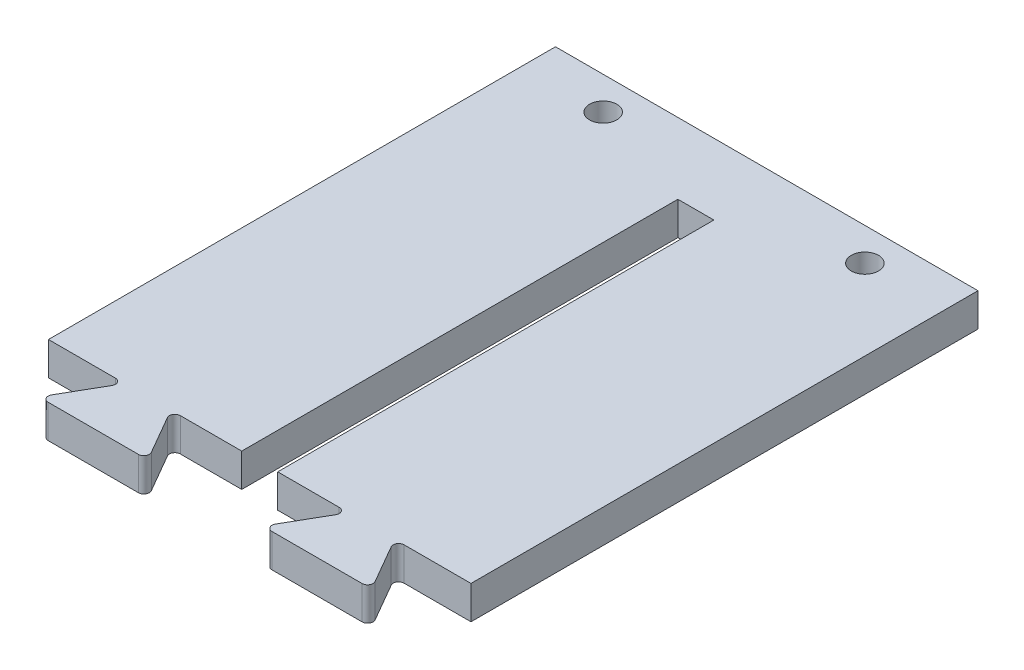
ISO-10303-21;
HEADER;
FILE_DESCRIPTION(('STEP AP214'),'2;1');
FILE_NAME('part.step','',(''),(''),'','','');
FILE_SCHEMA(('AUTOMOTIVE_DESIGN { 1 0 10303 214 1 1 1 1 }'));
ENDSEC;
DATA;
#1=APPLICATION_CONTEXT('core data for automotive mechanical design processes');
#2=APPLICATION_PROTOCOL_DEFINITION('international standard','automotive_design',2000,#1);
#3=PRODUCT_CONTEXT('',#1,'mechanical');
#4=PRODUCT('Part','Part','',(#3));
#5=PRODUCT_RELATED_PRODUCT_CATEGORY('part','',(#4));
#6=PRODUCT_DEFINITION_FORMATION('','',#4);
#7=PRODUCT_DEFINITION_CONTEXT('part definition',#1,'design');
#8=PRODUCT_DEFINITION('design','',#6,#7);
#9=PRODUCT_DEFINITION_SHAPE('','',#8);
#10=(LENGTH_UNIT() NAMED_UNIT(*) SI_UNIT(.MILLI.,.METRE.));
#11=(NAMED_UNIT(*) PLANE_ANGLE_UNIT() SI_UNIT($,.RADIAN.));
#12=(NAMED_UNIT(*) SI_UNIT($,.STERADIAN.) SOLID_ANGLE_UNIT());
#13=UNCERTAINTY_MEASURE_WITH_UNIT(LENGTH_MEASURE(1.E-05),#10,'distance_accuracy_value','');
#14=(GEOMETRIC_REPRESENTATION_CONTEXT(3) GLOBAL_UNCERTAINTY_ASSIGNED_CONTEXT((#13)) GLOBAL_UNIT_ASSIGNED_CONTEXT((#10,
#11,#12)) REPRESENTATION_CONTEXT('',''));
#15=CARTESIAN_POINT('',(0.,0.,0.));
#16=DIRECTION('',(0.,0.,1.));
#17=DIRECTION('',(1.,0.,0.));
#18=AXIS2_PLACEMENT_3D('',#15,#16,#17);
#19=CARTESIAN_POINT('',(8.14850269189633,3.05,3.12748952567449E-13));
#20=DIRECTION('',(0.,0.,-1.));
#21=DIRECTION('',(-1.,0.,0.));
#22=AXIS2_PLACEMENT_3D('',#19,#20,#21);
#23=PLANE('',#22);
#24=DIRECTION('',(1.,0.,0.));
#25=VECTOR('',#24,1.);
#26=CARTESIAN_POINT('',(8.14850269189633,0.,3.12748952567449E-13));
#27=LINE('',#26,#25);
#28=CARTESIAN_POINT('',(-7.28247728811184,0.,3.14638702591471E-13));
#29=VERTEX_POINT('',#28);
#30=CARTESIAN_POINT('',(-1.65,0.,0.));
#31=VERTEX_POINT('',#30);
#32=EDGE_CURVE('E217',#29,#31,#27,.T.);
#33=ORIENTED_EDGE('',*,*,#32,.T.);
#34=DIRECTION('',(0.,1.,0.));
#35=VECTOR('',#34,1.);
#36=CARTESIAN_POINT('',(-1.65,0.,0.));
#37=LINE('',#36,#35);
#38=CARTESIAN_POINT('',(-1.65,3.05,0.));
#39=VERTEX_POINT('',#38);
#40=EDGE_CURVE('E202',#31,#39,#37,.T.);
#41=ORIENTED_EDGE('',*,*,#40,.T.);
#42=DIRECTION('',(1.,0.,0.));
#43=VECTOR('',#42,1.);
#44=CARTESIAN_POINT('',(8.14850269189633,3.05,3.12748952567449E-13));
#45=LINE('',#44,#43);
#46=CARTESIAN_POINT('',(-7.28247728811184,3.05,3.14638702591471E-13));
#47=VERTEX_POINT('',#46);
#48=EDGE_CURVE('E364',#47,#39,#45,.T.);
#49=ORIENTED_EDGE('',*,*,#48,.F.);
#50=DIRECTION('',(0.,-1.,0.));
#51=VECTOR('',#50,1.);
#52=CARTESIAN_POINT('',(-7.28247728811184,0.,3.14638702591471E-13));
#53=LINE('',#52,#51);
#54=EDGE_CURVE('E224',#47,#29,#53,.T.);
#55=ORIENTED_EDGE('',*,*,#54,.T.);
#56=EDGE_LOOP('',(#33,#41,#49,#55));
#57=FACE_BOUND('',#56,.T.);
#58=ADVANCED_FACE('F40',(#57),#23,.F.);
#59=CARTESIAN_POINT('',(-12.3749999999999,3.05,0.));
#60=DIRECTION('',(0.,0.,-1.));
#61=DIRECTION('',(-1.,0.,0.));
#62=AXIS2_PLACEMENT_3D('',#59,#60,#61);
#63=PLANE('',#62);
#64=DIRECTION('',(1.,0.,0.));
#65=VECTOR('',#64,1.);
#66=CARTESIAN_POINT('',(-12.3749999999999,0.,0.));
#67=LINE('',#66,#65);
#68=CARTESIAN_POINT('',(-19.3749999999999,0.,0.));
#69=VERTEX_POINT('',#68);
#70=CARTESIAN_POINT('',(-13.2410254037843,0.,0.));
#71=VERTEX_POINT('',#70);
#72=EDGE_CURVE('E331',#69,#71,#67,.T.);
#73=ORIENTED_EDGE('',*,*,#72,.T.);
#74=DIRECTION('',(0.,-1.,0.));
#75=VECTOR('',#74,1.);
#76=CARTESIAN_POINT('',(-13.2410254037843,3.05,0.));
#77=LINE('',#76,#75);
#78=CARTESIAN_POINT('',(-13.2410254037843,3.05,0.));
#79=VERTEX_POINT('',#78);
#80=EDGE_CURVE('E313',#71,#79,#77,.F.);
#81=ORIENTED_EDGE('',*,*,#80,.T.);
#82=DIRECTION('',(1.,0.,0.));
#83=VECTOR('',#82,1.);
#84=CARTESIAN_POINT('',(-12.3749999999999,3.05,0.));
#85=LINE('',#84,#83);
#86=CARTESIAN_POINT('',(-19.3749999999999,3.05,0.));
#87=VERTEX_POINT('',#86);
#88=EDGE_CURVE('E247',#87,#79,#85,.T.);
#89=ORIENTED_EDGE('',*,*,#88,.F.);
#90=DIRECTION('',(0.,-1.,0.));
#91=VECTOR('',#90,1.);
#92=CARTESIAN_POINT('',(-19.3749999999999,3.05,0.));
#93=LINE('',#92,#91);
#94=EDGE_CURVE('E248',#87,#69,#93,.T.);
#95=ORIENTED_EDGE('',*,*,#94,.T.);
#96=EDGE_LOOP('',(#73,#81,#89,#95));
#97=FACE_BOUND('',#96,.T.);
#98=ADVANCED_FACE('F338',(#97),#63,.F.);
#99=CARTESIAN_POINT('',(-15.261751345948,3.05,5.));
#100=DIRECTION('',(0.86602540378444,0.,0.499999999999998));
#101=DIRECTION('',(0.499999999999998,0.,-0.86602540378444));
#102=AXIS2_PLACEMENT_3D('',#99,#100,#101);
#103=PLANE('',#102);
#104=DIRECTION('',(-0.499999999999998,0.,0.86602540378444));
#105=VECTOR('',#104,1.);
#106=CARTESIAN_POINT('',(-15.261751345948,0.,5.));
#107=LINE('',#106,#105);
#108=CARTESIAN_POINT('',(-12.8080127018921,0.,0.75));
#109=VERTEX_POINT('',#108);
#110=CARTESIAN_POINT('',(-14.8287386440558,0.,4.25));
#111=VERTEX_POINT('',#110);
#112=EDGE_CURVE('E333',#109,#111,#107,.T.);
#113=ORIENTED_EDGE('',*,*,#112,.T.);
#114=DIRECTION('',(0.,-1.,0.));
#115=VECTOR('',#114,1.);
#116=CARTESIAN_POINT('',(-14.8287386440558,3.05,4.25));
#117=LINE('',#116,#115);
#118=CARTESIAN_POINT('',(-14.8287386440558,3.05,4.25));
#119=VERTEX_POINT('',#118);
#120=EDGE_CURVE('E311',#111,#119,#117,.F.);
#121=ORIENTED_EDGE('',*,*,#120,.T.);
#122=DIRECTION('',(-0.499999999999998,0.,0.86602540378444));
#123=VECTOR('',#122,1.);
#124=CARTESIAN_POINT('',(-15.261751345948,3.05,5.));
#125=LINE('',#124,#123);
#126=CARTESIAN_POINT('',(-12.8080127018921,3.05,0.75));
#127=VERTEX_POINT('',#126);
#128=EDGE_CURVE('E349',#127,#119,#125,.T.);
#129=ORIENTED_EDGE('',*,*,#128,.F.);
#130=DIRECTION('',(0.,-1.,0.));
#131=VECTOR('',#130,1.);
#132=CARTESIAN_POINT('',(-12.8080127018921,0.,0.749999999999999));
#133=LINE('',#132,#131);
#134=EDGE_CURVE('E308',#127,#109,#133,.T.);
#135=ORIENTED_EDGE('',*,*,#134,.T.);
#136=EDGE_LOOP('',(#113,#121,#129,#135));
#137=FACE_BOUND('',#136,.T.);
#138=ADVANCED_FACE('F352',(#137),#103,.F.);
#139=CARTESIAN_POINT('',(-5.26175134594803,3.05,5.));
#140=DIRECTION('',(0.,0.,-1.));
#141=DIRECTION('',(-1.,0.,0.));
#142=AXIS2_PLACEMENT_3D('',#139,#140,#141);
#143=PLANE('',#142);
#144=DIRECTION('',(1.,0.,0.));
#145=VECTOR('',#144,1.);
#146=CARTESIAN_POINT('',(-5.26175134594803,0.,5.));
#147=LINE('',#146,#145);
#148=CARTESIAN_POINT('',(-14.3957259421635,0.,5.));
#149=VERTEX_POINT('',#148);
#150=CARTESIAN_POINT('',(-6.12777674973252,0.,5.));
#151=VERTEX_POINT('',#150);
#152=EDGE_CURVE('E381',#149,#151,#147,.T.);
#153=ORIENTED_EDGE('',*,*,#152,.T.);
#154=DIRECTION('',(0.,-1.,0.));
#155=VECTOR('',#154,1.);
#156=CARTESIAN_POINT('',(-6.12777674973252,3.05,5.));
#157=LINE('',#156,#155);
#158=CARTESIAN_POINT('',(-6.12777674973252,3.05,5.));
#159=VERTEX_POINT('',#158);
#160=EDGE_CURVE('E306',#151,#159,#157,.F.);
#161=ORIENTED_EDGE('',*,*,#160,.T.);
#162=DIRECTION('',(1.,0.,0.));
#163=VECTOR('',#162,1.);
#164=CARTESIAN_POINT('',(-5.26175134594803,3.05,5.));
#165=LINE('',#164,#163);
#166=CARTESIAN_POINT('',(-14.3957259421635,3.05,5.));
#167=VERTEX_POINT('',#166);
#168=EDGE_CURVE('E354',#167,#159,#165,.T.);
#169=ORIENTED_EDGE('',*,*,#168,.F.);
#170=DIRECTION('',(0.,-1.,0.));
#171=VECTOR('',#170,1.);
#172=CARTESIAN_POINT('',(-14.3957259421635,3.05,5.));
#173=LINE('',#172,#171);
#174=EDGE_CURVE('E303',#167,#149,#173,.T.);
#175=ORIENTED_EDGE('',*,*,#174,.T.);
#176=EDGE_LOOP('',(#153,#161,#169,#175));
#177=FACE_BOUND('',#176,.T.);
#178=ADVANCED_FACE('F403',(#177),#143,.F.);
#179=CARTESIAN_POINT('',(-8.14850269189633,3.05,3.14744760115344E-13));
#180=DIRECTION('',(-0.866025403784412,0.,0.500000000000046));
#181=DIRECTION('',(0.500000000000046,0.,0.866025403784412));
#182=AXIS2_PLACEMENT_3D('',#179,#180,#181);
#183=PLANE('',#182);
#184=DIRECTION('',(-0.500000000000046,0.,-0.866025403784412));
#185=VECTOR('',#184,1.);
#186=CARTESIAN_POINT('',(-8.14850269189633,0.,3.14744760115344E-13));
#187=LINE('',#186,#185);
#188=CARTESIAN_POINT('',(-5.69476404784032,0.,4.24999999999998));
#189=VERTEX_POINT('',#188);
#190=CARTESIAN_POINT('',(-7.71548999000405,0.,0.750000000000337));
#191=VERTEX_POINT('',#190);
#192=EDGE_CURVE('E230',#189,#191,#187,.T.);
#193=ORIENTED_EDGE('',*,*,#192,.T.);
#194=DIRECTION('',(0.,-1.,0.));
#195=VECTOR('',#194,1.);
#196=CARTESIAN_POINT('',(-7.71548999000405,3.05,0.750000000000337));
#197=LINE('',#196,#195);
#198=CARTESIAN_POINT('',(-7.71548999000405,3.05,0.750000000000337));
#199=VERTEX_POINT('',#198);
#200=EDGE_CURVE('E301',#191,#199,#197,.F.);
#201=ORIENTED_EDGE('',*,*,#200,.T.);
#202=DIRECTION('',(-0.500000000000046,0.,-0.866025403784412));
#203=VECTOR('',#202,1.);
#204=CARTESIAN_POINT('',(-8.14850269189633,3.05,3.14744760115344E-13));
#205=LINE('',#204,#203);
#206=CARTESIAN_POINT('',(-5.69476404784032,3.05,4.24999999999998));
#207=VERTEX_POINT('',#206);
#208=EDGE_CURVE('E357',#207,#199,#205,.T.);
#209=ORIENTED_EDGE('',*,*,#208,.F.);
#210=DIRECTION('',(0.,-1.,0.));
#211=VECTOR('',#210,1.);
#212=CARTESIAN_POINT('',(-5.69476404784032,3.05,4.24999999999998));
#213=LINE('',#212,#211);
#214=EDGE_CURVE('E298',#207,#189,#213,.T.);
#215=ORIENTED_EDGE('',*,*,#214,.T.);
#216=EDGE_LOOP('',(#193,#201,#209,#215));
#217=FACE_BOUND('',#216,.T.);
#218=ADVANCED_FACE('F390',(#217),#183,.F.);
#219=CARTESIAN_POINT('',(1.65000000000001,3.05,0.));
#220=VERTEX_POINT('',#219);
#221=CARTESIAN_POINT('',(7.28247728811188,3.05,3.12855010091321E-13));
#222=VERTEX_POINT('',#221);
#223=EDGE_CURVE('E363',#220,#222,#45,.T.);
#224=ORIENTED_EDGE('',*,*,#223,.F.);
#225=DIRECTION('',(0.,1.,0.));
#226=VECTOR('',#225,1.);
#227=CARTESIAN_POINT('',(1.65000000000001,0.,0.));
#228=LINE('',#227,#226);
#229=CARTESIAN_POINT('',(1.65000000000001,0.,0.));
#230=VERTEX_POINT('',#229);
#231=EDGE_CURVE('E212',#230,#220,#228,.T.);
#232=ORIENTED_EDGE('',*,*,#231,.F.);
#233=CARTESIAN_POINT('',(7.28247728811188,0.,3.12855010091321E-13));
#234=VERTEX_POINT('',#233);
#235=EDGE_CURVE('E226',#230,#234,#27,.T.);
#236=ORIENTED_EDGE('',*,*,#235,.T.);
#237=DIRECTION('',(0.,-1.,0.));
#238=VECTOR('',#237,1.);
#239=CARTESIAN_POINT('',(7.28247728811188,3.05,3.12855010091321E-13));
#240=LINE('',#239,#238);
#241=EDGE_CURVE('E295',#234,#222,#240,.F.);
#242=ORIENTED_EDGE('',*,*,#241,.T.);
#243=EDGE_LOOP('',(#224,#232,#236,#242));
#244=FACE_BOUND('',#243,.T.);
#245=ADVANCED_FACE('F410',(#244),#23,.F.);
#246=CARTESIAN_POINT('',(5.2617513459483,3.05,5.00000000000001));
#247=DIRECTION('',(0.866025403784432,0.,0.500000000000011));
#248=DIRECTION('',(0.500000000000011,0.,-0.866025403784432));
#249=AXIS2_PLACEMENT_3D('',#246,#247,#248);
#250=PLANE('',#249);
#251=DIRECTION('',(-0.500000000000011,0.,0.866025403784432));
#252=VECTOR('',#251,1.);
#253=CARTESIAN_POINT('',(5.2617513459483,0.,5.00000000000001));
#254=LINE('',#253,#252);
#255=CARTESIAN_POINT('',(7.7154899900041,0.,0.750000000000319));
#256=VERTEX_POINT('',#255);
#257=CARTESIAN_POINT('',(5.69476404784053,0.,4.25));
#258=VERTEX_POINT('',#257);
#259=EDGE_CURVE('E225',#256,#258,#254,.T.);
#260=ORIENTED_EDGE('',*,*,#259,.T.);
#261=DIRECTION('',(0.,-1.,0.));
#262=VECTOR('',#261,1.);
#263=CARTESIAN_POINT('',(5.69476404784053,3.05,4.25));
#264=LINE('',#263,#262);
#265=CARTESIAN_POINT('',(5.69476404784053,3.05,4.25));
#266=VERTEX_POINT('',#265);
#267=EDGE_CURVE('E63',#258,#266,#264,.F.);
#268=ORIENTED_EDGE('',*,*,#267,.T.);
#269=DIRECTION('',(-0.500000000000011,0.,0.866025403784432));
#270=VECTOR('',#269,1.);
#271=CARTESIAN_POINT('',(5.2617513459483,3.05,5.00000000000001));
#272=LINE('',#271,#270);
#273=CARTESIAN_POINT('',(7.7154899900041,3.05,0.750000000000319));
#274=VERTEX_POINT('',#273);
#275=EDGE_CURVE('E366',#274,#266,#272,.T.);
#276=ORIENTED_EDGE('',*,*,#275,.F.);
#277=DIRECTION('',(0.,-1.,0.));
#278=VECTOR('',#277,1.);
#279=CARTESIAN_POINT('',(7.7154899900041,0.,0.750000000000317));
#280=LINE('',#279,#278);
#281=EDGE_CURVE('E290',#274,#256,#280,.T.);
#282=ORIENTED_EDGE('',*,*,#281,.T.);
#283=EDGE_LOOP('',(#260,#268,#276,#282));
#284=FACE_BOUND('',#283,.T.);
#285=ADVANCED_FACE('F421',(#284),#250,.F.);
#286=CARTESIAN_POINT('',(15.2617513459483,3.05,5.00000000000001));
#287=DIRECTION('',(0.,0.,-1.));
#288=DIRECTION('',(-1.,0.,0.));
#289=AXIS2_PLACEMENT_3D('',#286,#287,#288);
#290=PLANE('',#289);
#291=DIRECTION('',(1.,0.,0.));
#292=VECTOR('',#291,1.);
#293=CARTESIAN_POINT('',(15.2617513459483,0.,5.00000000000001));
#294=LINE('',#293,#292);
#295=CARTESIAN_POINT('',(6.12777674973275,0.,5.00000000000001));
#296=VERTEX_POINT('',#295);
#297=CARTESIAN_POINT('',(14.3957259421639,0.,5.00000000000001));
#298=VERTEX_POINT('',#297);
#299=EDGE_CURVE('E228',#296,#298,#294,.T.);
#300=ORIENTED_EDGE('',*,*,#299,.T.);
#301=DIRECTION('',(0.,-1.,0.));
#302=VECTOR('',#301,1.);
#303=CARTESIAN_POINT('',(14.3957259421639,3.05,5.00000000000001));
#304=LINE('',#303,#302);
#305=CARTESIAN_POINT('',(14.3957259421639,3.05,5.00000000000001));
#306=VERTEX_POINT('',#305);
#307=EDGE_CURVE('E280',#298,#306,#304,.F.);
#308=ORIENTED_EDGE('',*,*,#307,.T.);
#309=DIRECTION('',(1.,0.,0.));
#310=VECTOR('',#309,1.);
#311=CARTESIAN_POINT('',(15.2617513459483,3.05,5.00000000000001));
#312=LINE('',#311,#310);
#313=CARTESIAN_POINT('',(6.12777674973275,3.05,5.00000000000001));
#314=VERTEX_POINT('',#313);
#315=EDGE_CURVE('E368',#314,#306,#312,.T.);
#316=ORIENTED_EDGE('',*,*,#315,.F.);
#317=DIRECTION('',(0.,-1.,0.));
#318=VECTOR('',#317,1.);
#319=CARTESIAN_POINT('',(6.12777674973275,3.05,5.00000000000001));
#320=LINE('',#319,#318);
#321=EDGE_CURVE('E277',#314,#296,#320,.T.);
#322=ORIENTED_EDGE('',*,*,#321,.T.);
#323=EDGE_LOOP('',(#300,#308,#316,#322));
#324=FACE_BOUND('',#323,.T.);
#325=ADVANCED_FACE('F426',(#324),#290,.F.);
#326=CARTESIAN_POINT('',(12.3750000000001,3.05,0.));
#327=DIRECTION('',(-0.866025403784432,0.,0.500000000000011));
#328=DIRECTION('',(0.500000000000011,0.,0.866025403784432));
#329=AXIS2_PLACEMENT_3D('',#326,#327,#328);
#330=PLANE('',#329);
#331=DIRECTION('',(-0.500000000000011,0.,-0.866025403784432));
#332=VECTOR('',#331,1.);
#333=CARTESIAN_POINT('',(12.3750000000001,0.,0.));
#334=LINE('',#333,#332);
#335=CARTESIAN_POINT('',(14.8287386440561,0.,4.25));
#336=VERTEX_POINT('',#335);
#337=CARTESIAN_POINT('',(12.8080127018924,0.,0.750000000000013));
#338=VERTEX_POINT('',#337);
#339=EDGE_CURVE('E236',#336,#338,#334,.T.);
#340=ORIENTED_EDGE('',*,*,#339,.T.);
#341=DIRECTION('',(0.,-1.,0.));
#342=VECTOR('',#341,1.);
#343=CARTESIAN_POINT('',(12.8080127018924,3.05,0.750000000000013));
#344=LINE('',#343,#342);
#345=CARTESIAN_POINT('',(12.8080127018924,3.05,0.750000000000013));
#346=VERTEX_POINT('',#345);
#347=EDGE_CURVE('E267',#338,#346,#344,.F.);
#348=ORIENTED_EDGE('',*,*,#347,.T.);
#349=DIRECTION('',(-0.500000000000011,0.,-0.866025403784432));
#350=VECTOR('',#349,1.);
#351=CARTESIAN_POINT('',(12.3750000000001,3.05,0.));
#352=LINE('',#351,#350);
#353=CARTESIAN_POINT('',(14.8287386440561,3.05,4.25));
#354=VERTEX_POINT('',#353);
#355=EDGE_CURVE('E371',#354,#346,#352,.T.);
#356=ORIENTED_EDGE('',*,*,#355,.F.);
#357=DIRECTION('',(0.,-1.,0.));
#358=VECTOR('',#357,1.);
#359=CARTESIAN_POINT('',(14.8287386440561,3.05,4.25));
#360=LINE('',#359,#358);
#361=EDGE_CURVE('E264',#354,#336,#360,.T.);
#362=ORIENTED_EDGE('',*,*,#361,.T.);
#363=EDGE_LOOP('',(#340,#348,#356,#362));
#364=FACE_BOUND('',#363,.T.);
#365=ADVANCED_FACE('F506',(#364),#330,.F.);
#366=CARTESIAN_POINT('',(19.3750000000001,3.05,0.));
#367=DIRECTION('',(0.,0.,-1.));
#368=DIRECTION('',(-1.,0.,0.));
#369=AXIS2_PLACEMENT_3D('',#366,#367,#368);
#370=PLANE('',#369);
#371=DIRECTION('',(1.,0.,0.));
#372=VECTOR('',#371,1.);
#373=CARTESIAN_POINT('',(19.3750000000001,3.05,0.));
#374=LINE('',#373,#372);
#375=CARTESIAN_POINT('',(13.2410254037846,3.05,0.));
#376=VERTEX_POINT('',#375);
#377=CARTESIAN_POINT('',(19.3750000000001,3.05,0.));
#378=VERTEX_POINT('',#377);
#379=EDGE_CURVE('E374',#376,#378,#374,.T.);
#380=ORIENTED_EDGE('',*,*,#379,.F.);
#381=DIRECTION('',(0.,-1.,0.));
#382=VECTOR('',#381,1.);
#383=CARTESIAN_POINT('',(13.2410254037846,0.,0.));
#384=LINE('',#383,#382);
#385=CARTESIAN_POINT('',(13.2410254037846,0.,0.));
#386=VERTEX_POINT('',#385);
#387=EDGE_CURVE('E261',#376,#386,#384,.T.);
#388=ORIENTED_EDGE('',*,*,#387,.T.);
#389=DIRECTION('',(1.,0.,0.));
#390=VECTOR('',#389,1.);
#391=CARTESIAN_POINT('',(19.3750000000001,0.,0.));
#392=LINE('',#391,#390);
#393=CARTESIAN_POINT('',(19.3750000000001,0.,0.));
#394=VERTEX_POINT('',#393);
#395=EDGE_CURVE('E239',#386,#394,#392,.T.);
#396=ORIENTED_EDGE('',*,*,#395,.T.);
#397=DIRECTION('',(0.,-1.,0.));
#398=VECTOR('',#397,1.);
#399=CARTESIAN_POINT('',(19.3750000000001,3.05,0.));
#400=LINE('',#399,#398);
#401=EDGE_CURVE('E258',#378,#394,#400,.T.);
#402=ORIENTED_EDGE('',*,*,#401,.F.);
#403=EDGE_LOOP('',(#380,#388,#396,#402));
#404=FACE_BOUND('',#403,.T.);
#405=ADVANCED_FACE('F502',(#404),#370,.F.);
#406=CARTESIAN_POINT('',(19.3750000000001,3.05,-46.5));
#407=DIRECTION('',(-1.,0.,0.));
#408=DIRECTION('',(0.,0.,1.));
#409=AXIS2_PLACEMENT_3D('',#406,#407,#408);
#410=PLANE('',#409);
#411=DIRECTION('',(0.,0.,-1.));
#412=VECTOR('',#411,1.);
#413=CARTESIAN_POINT('',(19.3750000000001,0.,-46.5));
#414=LINE('',#413,#412);
#415=CARTESIAN_POINT('',(19.3750000000001,0.,-46.5));
#416=VERTEX_POINT('',#415);
#417=EDGE_CURVE('E241',#394,#416,#414,.T.);
#418=ORIENTED_EDGE('',*,*,#417,.T.);
#419=DIRECTION('',(0.,-1.,0.));
#420=VECTOR('',#419,1.);
#421=CARTESIAN_POINT('',(19.3750000000001,3.05,-46.5));
#422=LINE('',#421,#420);
#423=CARTESIAN_POINT('',(19.3750000000001,3.05,-46.5));
#424=VERTEX_POINT('',#423);
#425=EDGE_CURVE('E255',#424,#416,#422,.T.);
#426=ORIENTED_EDGE('',*,*,#425,.F.);
#427=DIRECTION('',(0.,0.,-1.));
#428=VECTOR('',#427,1.);
#429=CARTESIAN_POINT('',(19.3750000000001,3.05,-46.5));
#430=LINE('',#429,#428);
#431=EDGE_CURVE('E376',#378,#424,#430,.T.);
#432=ORIENTED_EDGE('',*,*,#431,.F.);
#433=ORIENTED_EDGE('',*,*,#401,.T.);
#434=EDGE_LOOP('',(#418,#426,#432,#433));
#435=FACE_BOUND('',#434,.T.);
#436=ADVANCED_FACE('F498',(#435),#410,.F.);
#437=CARTESIAN_POINT('',(-19.3749999999999,3.05,-46.5));
#438=DIRECTION('',(0.,0.,1.));
#439=DIRECTION('',(1.,0.,0.));
#440=AXIS2_PLACEMENT_3D('',#437,#438,#439);
#441=PLANE('',#440);
#442=DIRECTION('',(-1.,0.,0.));
#443=VECTOR('',#442,1.);
#444=CARTESIAN_POINT('',(-19.3749999999999,0.,-46.5));
#445=LINE('',#444,#443);
#446=CARTESIAN_POINT('',(-19.3749999999999,0.,-46.5));
#447=VERTEX_POINT('',#446);
#448=EDGE_CURVE('E243',#416,#447,#445,.T.);
#449=ORIENTED_EDGE('',*,*,#448,.T.);
#450=DIRECTION('',(0.,-1.,0.));
#451=VECTOR('',#450,1.);
#452=CARTESIAN_POINT('',(-19.3749999999999,3.05,-46.5));
#453=LINE('',#452,#451);
#454=CARTESIAN_POINT('',(-19.3749999999999,3.05,-46.5));
#455=VERTEX_POINT('',#454);
#456=EDGE_CURVE('E251',#455,#447,#453,.T.);
#457=ORIENTED_EDGE('',*,*,#456,.F.);
#458=DIRECTION('',(-1.,0.,0.));
#459=VECTOR('',#458,1.);
#460=CARTESIAN_POINT('',(-19.3749999999999,3.05,-46.5));
#461=LINE('',#460,#459);
#462=EDGE_CURVE('E378',#424,#455,#461,.T.);
#463=ORIENTED_EDGE('',*,*,#462,.F.);
#464=ORIENTED_EDGE('',*,*,#425,.T.);
#465=EDGE_LOOP('',(#449,#457,#463,#464));
#466=FACE_BOUND('',#465,.T.);
#467=ADVANCED_FACE('F494',(#466),#441,.F.);
#468=CARTESIAN_POINT('',(-19.3749999999999,3.05,0.));
#469=DIRECTION('',(1.,0.,0.));
#470=DIRECTION('',(0.,0.,-1.));
#471=AXIS2_PLACEMENT_3D('',#468,#469,#470);
#472=PLANE('',#471);
#473=DIRECTION('',(0.,0.,1.));
#474=VECTOR('',#473,1.);
#475=CARTESIAN_POINT('',(-19.3749999999999,0.,0.));
#476=LINE('',#475,#474);
#477=EDGE_CURVE('E245',#447,#69,#476,.T.);
#478=ORIENTED_EDGE('',*,*,#477,.T.);
#479=ORIENTED_EDGE('',*,*,#94,.F.);
#480=DIRECTION('',(0.,0.,1.));
#481=VECTOR('',#480,1.);
#482=CARTESIAN_POINT('',(-19.3749999999999,3.05,0.));
#483=LINE('',#482,#481);
#484=EDGE_CURVE('E252',#455,#87,#483,.T.);
#485=ORIENTED_EDGE('',*,*,#484,.F.);
#486=ORIENTED_EDGE('',*,*,#456,.T.);
#487=EDGE_LOOP('',(#478,#479,#485,#486));
#488=FACE_BOUND('',#487,.T.);
#489=ADVANCED_FACE('F466',(#488),#472,.F.);
#490=CARTESIAN_POINT('',(0.,3.05,0.));
#491=DIRECTION('',(0.,-1.,0.));
#492=DIRECTION('',(0.,0.,-1.));
#493=AXIS2_PLACEMENT_3D('',#490,#491,#492);
#494=PLANE('',#493);
#495=CARTESIAN_POINT('',(-12.,3.05,-43.5));
#496=DIRECTION('',(0.,1.,0.));
#497=DIRECTION('',(0.,0.,1.));
#498=AXIS2_PLACEMENT_3D('',#495,#496,#497);
#499=CIRCLE('',#498,1.25);
#500=CARTESIAN_POINT('',(-12.,3.05,-42.25));
#501=VERTEX_POINT('',#500);
#502=EDGE_CURVE('E458',#501,#501,#499,.T.);
#503=ORIENTED_EDGE('',*,*,#502,.F.);
#504=EDGE_LOOP('',(#503));
#505=FACE_BOUND('',#504,.T.);
#506=CARTESIAN_POINT('',(12.,3.05,-43.5));
#507=DIRECTION('',(0.,1.,0.));
#508=DIRECTION('',(0.,0.,1.));
#509=AXIS2_PLACEMENT_3D('',#506,#507,#508);
#510=CIRCLE('',#509,1.25);
#511=CARTESIAN_POINT('',(12.,3.05,-42.25));
#512=VERTEX_POINT('',#511);
#513=EDGE_CURVE('E452',#512,#512,#510,.T.);
#514=ORIENTED_EDGE('',*,*,#513,.F.);
#515=EDGE_LOOP('',(#514));
#516=FACE_BOUND('',#515,.T.);
#517=ORIENTED_EDGE('',*,*,#48,.T.);
#518=DIRECTION('',(0.,0.,1.));
#519=VECTOR('',#518,1.);
#520=CARTESIAN_POINT('',(-1.65,3.05,-40.));
#521=LINE('',#520,#519);
#522=CARTESIAN_POINT('',(-1.65,3.05,-40.));
#523=VERTEX_POINT('',#522);
#524=EDGE_CURVE('E207',#523,#39,#521,.T.);
#525=ORIENTED_EDGE('',*,*,#524,.F.);
#526=DIRECTION('',(-1.,0.,0.));
#527=VECTOR('',#526,1.);
#528=CARTESIAN_POINT('',(-1.65,3.05,-40.));
#529=LINE('',#528,#527);
#530=CARTESIAN_POINT('',(1.65,3.05,-40.));
#531=VERTEX_POINT('',#530);
#532=EDGE_CURVE('E220',#531,#523,#529,.T.);
#533=ORIENTED_EDGE('',*,*,#532,.F.);
#534=DIRECTION('',(0.,0.,-1.));
#535=VECTOR('',#534,1.);
#536=CARTESIAN_POINT('',(1.65,3.05,-40.));
#537=LINE('',#536,#535);
#538=EDGE_CURVE('E435',#220,#531,#537,.T.);
#539=ORIENTED_EDGE('',*,*,#538,.F.);
#540=ORIENTED_EDGE('',*,*,#223,.T.);
#541=CARTESIAN_POINT('',(7.28247728811188,3.05,0.500000000000312));
#542=DIRECTION('',(0.,-1.,0.));
#543=DIRECTION('',(0.,0.,-1.));
#544=AXIS2_PLACEMENT_3D('',#541,#542,#543);
#545=CIRCLE('',#544,0.5);
#546=EDGE_CURVE('E322',#222,#274,#545,.T.);
#547=ORIENTED_EDGE('',*,*,#546,.T.);
#548=ORIENTED_EDGE('',*,*,#275,.T.);
#549=CARTESIAN_POINT('',(6.12777674973275,3.05,4.50000000000001));
#550=DIRECTION('',(0.,-1.,0.));
#551=DIRECTION('',(0.,0.,-1.));
#552=AXIS2_PLACEMENT_3D('',#549,#550,#551);
#553=CIRCLE('',#552,0.5);
#554=EDGE_CURVE('E286',#266,#314,#553,.F.);
#555=ORIENTED_EDGE('',*,*,#554,.T.);
#556=ORIENTED_EDGE('',*,*,#315,.T.);
#557=CARTESIAN_POINT('',(14.3957259421639,3.05,4.50000000000001));
#558=DIRECTION('',(0.,-1.,0.));
#559=DIRECTION('',(0.,0.,-1.));
#560=AXIS2_PLACEMENT_3D('',#557,#558,#559);
#561=CIRCLE('',#560,0.5);
#562=EDGE_CURVE('E288',#306,#354,#561,.F.);
#563=ORIENTED_EDGE('',*,*,#562,.T.);
#564=ORIENTED_EDGE('',*,*,#355,.T.);
#565=CARTESIAN_POINT('',(13.2410254037846,3.05,0.500000000000007));
#566=DIRECTION('',(0.,-1.,0.));
#567=DIRECTION('',(0.,0.,-1.));
#568=AXIS2_PLACEMENT_3D('',#565,#566,#567);
#569=CIRCLE('',#568,0.5);
#570=EDGE_CURVE('E317',#346,#376,#569,.T.);
#571=ORIENTED_EDGE('',*,*,#570,.T.);
#572=ORIENTED_EDGE('',*,*,#379,.T.);
#573=ORIENTED_EDGE('',*,*,#431,.T.);
#574=ORIENTED_EDGE('',*,*,#462,.T.);
#575=ORIENTED_EDGE('',*,*,#484,.T.);
#576=ORIENTED_EDGE('',*,*,#88,.T.);
#577=CARTESIAN_POINT('',(-13.2410254037843,3.05,0.499999999999999));
#578=DIRECTION('',(0.,-1.,0.));
#579=DIRECTION('',(0.,0.,-1.));
#580=AXIS2_PLACEMENT_3D('',#577,#578,#579);
#581=CIRCLE('',#580,0.5);
#582=EDGE_CURVE('E11',#79,#127,#581,.T.);
#583=ORIENTED_EDGE('',*,*,#582,.T.);
#584=ORIENTED_EDGE('',*,*,#128,.T.);
#585=CARTESIAN_POINT('',(-14.3957259421635,3.05,4.5));
#586=DIRECTION('',(0.,-1.,0.));
#587=DIRECTION('',(0.,0.,-1.));
#588=AXIS2_PLACEMENT_3D('',#585,#586,#587);
#589=CIRCLE('',#588,0.5);
#590=EDGE_CURVE('E282',#119,#167,#589,.F.);
#591=ORIENTED_EDGE('',*,*,#590,.T.);
#592=ORIENTED_EDGE('',*,*,#168,.T.);
#593=CARTESIAN_POINT('',(-6.12777674973252,3.05,4.5));
#594=DIRECTION('',(0.,-1.,0.));
#595=DIRECTION('',(0.,0.,-1.));
#596=AXIS2_PLACEMENT_3D('',#593,#594,#595);
#597=CIRCLE('',#596,0.5);
#598=EDGE_CURVE('E284',#159,#207,#597,.F.);
#599=ORIENTED_EDGE('',*,*,#598,.T.);
#600=ORIENTED_EDGE('',*,*,#208,.T.);
#601=CARTESIAN_POINT('',(-7.28247728811184,3.05,0.500000000000315));
#602=DIRECTION('',(0.,-1.,0.));
#603=DIRECTION('',(0.,0.,-1.));
#604=AXIS2_PLACEMENT_3D('',#601,#602,#603);
#605=CIRCLE('',#604,0.5);
#606=EDGE_CURVE('E326',#199,#47,#605,.T.);
#607=ORIENTED_EDGE('',*,*,#606,.T.);
#608=EDGE_LOOP('',(#517,#525,#533,#539,#540,#547,#548,#555,#556,#563,#564,#571,#572,#573,#574,
#575,#576,#583,#584,#591,#592,#599,#600,#607));
#609=FACE_BOUND('',#608,.T.);
#610=ADVANCED_FACE('F348',(#505,#516,#609),#494,.F.);
#611=CARTESIAN_POINT('',(0.,0.,0.));
#612=DIRECTION('',(0.,-1.,0.));
#613=DIRECTION('',(0.,0.,-1.));
#614=AXIS2_PLACEMENT_3D('',#611,#612,#613);
#615=PLANE('',#614);
#616=CARTESIAN_POINT('',(-12.,0.,-43.5));
#617=DIRECTION('',(0.,1.,0.));
#618=DIRECTION('',(0.,0.,1.));
#619=AXIS2_PLACEMENT_3D('',#616,#617,#618);
#620=CIRCLE('',#619,1.25);
#621=CARTESIAN_POINT('',(-12.,0.,-42.25));
#622=VERTEX_POINT('',#621);
#623=EDGE_CURVE('E455',#622,#622,#620,.T.);
#624=ORIENTED_EDGE('',*,*,#623,.T.);
#625=EDGE_LOOP('',(#624));
#626=FACE_BOUND('',#625,.T.);
#627=CARTESIAN_POINT('',(12.,0.,-43.5));
#628=DIRECTION('',(0.,1.,0.));
#629=DIRECTION('',(0.,0.,1.));
#630=AXIS2_PLACEMENT_3D('',#627,#628,#629);
#631=CIRCLE('',#630,1.25);
#632=CARTESIAN_POINT('',(12.,0.,-42.25));
#633=VERTEX_POINT('',#632);
#634=EDGE_CURVE('E440',#633,#633,#631,.T.);
#635=ORIENTED_EDGE('',*,*,#634,.T.);
#636=EDGE_LOOP('',(#635));
#637=FACE_BOUND('',#636,.T.);
#638=DIRECTION('',(0.,0.,1.));
#639=VECTOR('',#638,1.);
#640=CARTESIAN_POINT('',(-1.65,0.,-40.));
#641=LINE('',#640,#639);
#642=CARTESIAN_POINT('',(-1.65,0.,-40.));
#643=VERTEX_POINT('',#642);
#644=EDGE_CURVE('E205',#643,#31,#641,.T.);
#645=ORIENTED_EDGE('',*,*,#644,.T.);
#646=ORIENTED_EDGE('',*,*,#32,.F.);
#647=CARTESIAN_POINT('',(-7.28247728811184,0.,0.500000000000315));
#648=DIRECTION('',(0.,-1.,0.));
#649=DIRECTION('',(0.,0.,-1.));
#650=AXIS2_PLACEMENT_3D('',#647,#648,#649);
#651=CIRCLE('',#650,0.5);
#652=EDGE_CURVE('E324',#29,#191,#651,.F.);
#653=ORIENTED_EDGE('',*,*,#652,.T.);
#654=ORIENTED_EDGE('',*,*,#192,.F.);
#655=CARTESIAN_POINT('',(-6.12777674973252,0.,4.5));
#656=DIRECTION('',(0.,-1.,0.));
#657=DIRECTION('',(0.,0.,-1.));
#658=AXIS2_PLACEMENT_3D('',#655,#656,#657);
#659=CIRCLE('',#658,0.5);
#660=EDGE_CURVE('E271',#189,#151,#659,.T.);
#661=ORIENTED_EDGE('',*,*,#660,.T.);
#662=ORIENTED_EDGE('',*,*,#152,.F.);
#663=CARTESIAN_POINT('',(-14.3957259421635,0.,4.5));
#664=DIRECTION('',(0.,-1.,0.));
#665=DIRECTION('',(0.,0.,-1.));
#666=AXIS2_PLACEMENT_3D('',#663,#664,#665);
#667=CIRCLE('',#666,0.5);
#668=EDGE_CURVE('E269',#149,#111,#667,.T.);
#669=ORIENTED_EDGE('',*,*,#668,.T.);
#670=ORIENTED_EDGE('',*,*,#112,.F.);
#671=CARTESIAN_POINT('',(-13.2410254037843,0.,0.499999999999999));
#672=DIRECTION('',(0.,-1.,0.));
#673=DIRECTION('',(0.,0.,-1.));
#674=AXIS2_PLACEMENT_3D('',#671,#672,#673);
#675=CIRCLE('',#674,0.5);
#676=EDGE_CURVE('E48',#109,#71,#675,.F.);
#677=ORIENTED_EDGE('',*,*,#676,.T.);
#678=ORIENTED_EDGE('',*,*,#72,.F.);
#679=ORIENTED_EDGE('',*,*,#477,.F.);
#680=ORIENTED_EDGE('',*,*,#448,.F.);
#681=ORIENTED_EDGE('',*,*,#417,.F.);
#682=ORIENTED_EDGE('',*,*,#395,.F.);
#683=CARTESIAN_POINT('',(13.2410254037846,0.,0.500000000000007));
#684=DIRECTION('',(0.,-1.,0.));
#685=DIRECTION('',(0.,0.,-1.));
#686=AXIS2_PLACEMENT_3D('',#683,#684,#685);
#687=CIRCLE('',#686,0.5);
#688=EDGE_CURVE('E315',#386,#338,#687,.F.);
#689=ORIENTED_EDGE('',*,*,#688,.T.);
#690=ORIENTED_EDGE('',*,*,#339,.F.);
#691=CARTESIAN_POINT('',(14.3957259421639,0.,4.50000000000001));
#692=DIRECTION('',(0.,-1.,0.));
#693=DIRECTION('',(0.,0.,-1.));
#694=AXIS2_PLACEMENT_3D('',#691,#692,#693);
#695=CIRCLE('',#694,0.5);
#696=EDGE_CURVE('E275',#336,#298,#695,.T.);
#697=ORIENTED_EDGE('',*,*,#696,.T.);
#698=ORIENTED_EDGE('',*,*,#299,.F.);
#699=CARTESIAN_POINT('',(6.12777674973275,0.,4.50000000000001));
#700=DIRECTION('',(0.,-1.,0.));
#701=DIRECTION('',(0.,0.,-1.));
#702=AXIS2_PLACEMENT_3D('',#699,#700,#701);
#703=CIRCLE('',#702,0.5);
#704=EDGE_CURVE('E273',#296,#258,#703,.T.);
#705=ORIENTED_EDGE('',*,*,#704,.T.);
#706=ORIENTED_EDGE('',*,*,#259,.F.);
#707=CARTESIAN_POINT('',(7.28247728811188,0.,0.500000000000312));
#708=DIRECTION('',(0.,-1.,0.));
#709=DIRECTION('',(0.,0.,-1.));
#710=AXIS2_PLACEMENT_3D('',#707,#708,#709);
#711=CIRCLE('',#710,0.5);
#712=EDGE_CURVE('E319',#256,#234,#711,.F.);
#713=ORIENTED_EDGE('',*,*,#712,.T.);
#714=ORIENTED_EDGE('',*,*,#235,.F.);
#715=DIRECTION('',(0.,0.,-1.));
#716=VECTOR('',#715,1.);
#717=CARTESIAN_POINT('',(1.65,0.,-40.));
#718=LINE('',#717,#716);
#719=CARTESIAN_POINT('',(1.65,0.,-40.));
#720=VERTEX_POINT('',#719);
#721=EDGE_CURVE('E219',#230,#720,#718,.T.);
#722=ORIENTED_EDGE('',*,*,#721,.T.);
#723=DIRECTION('',(-1.,0.,0.));
#724=VECTOR('',#723,1.);
#725=CARTESIAN_POINT('',(-1.65,0.,-40.));
#726=LINE('',#725,#724);
#727=EDGE_CURVE('E55',#720,#643,#726,.T.);
#728=ORIENTED_EDGE('',*,*,#727,.T.);
#729=EDGE_LOOP('',(#645,#646,#653,#654,#661,#662,#669,#670,#677,#678,#679,#680,#681,#682,#689,
#690,#697,#698,#705,#706,#713,#714,#722,#728));
#730=FACE_BOUND('',#729,.T.);
#731=ADVANCED_FACE('F216',(#626,#637,#730),#615,.T.);
#732=CARTESIAN_POINT('',(13.2410254037846,3.05,0.500000000000007));
#733=DIRECTION('',(0.,1.,0.));
#734=DIRECTION('',(0.,0.,1.));
#735=AXIS2_PLACEMENT_3D('',#732,#733,#734);
#736=CYLINDRICAL_SURFACE('',#735,0.5);
#737=ORIENTED_EDGE('',*,*,#570,.F.);
#738=ORIENTED_EDGE('',*,*,#347,.F.);
#739=ORIENTED_EDGE('',*,*,#688,.F.);
#740=ORIENTED_EDGE('',*,*,#387,.F.);
#741=EDGE_LOOP('',(#737,#738,#739,#740));
#742=FACE_BOUND('',#741,.T.);
#743=ADVANCED_FACE('F490',(#742),#736,.F.);
#744=CARTESIAN_POINT('',(14.3957259421639,3.05,4.50000000000001));
#745=DIRECTION('',(0.,-1.,0.));
#746=DIRECTION('',(0.,0.,-1.));
#747=AXIS2_PLACEMENT_3D('',#744,#745,#746);
#748=CYLINDRICAL_SURFACE('',#747,0.5);
#749=ORIENTED_EDGE('',*,*,#562,.F.);
#750=ORIENTED_EDGE('',*,*,#307,.F.);
#751=ORIENTED_EDGE('',*,*,#696,.F.);
#752=ORIENTED_EDGE('',*,*,#361,.F.);
#753=EDGE_LOOP('',(#749,#750,#751,#752));
#754=FACE_BOUND('',#753,.T.);
#755=ADVANCED_FACE('F521',(#754),#748,.T.);
#756=CARTESIAN_POINT('',(6.12777674973275,3.05,4.50000000000001));
#757=DIRECTION('',(0.,-1.,0.));
#758=DIRECTION('',(0.,0.,-1.));
#759=AXIS2_PLACEMENT_3D('',#756,#757,#758);
#760=CYLINDRICAL_SURFACE('',#759,0.5);
#761=ORIENTED_EDGE('',*,*,#554,.F.);
#762=ORIENTED_EDGE('',*,*,#267,.F.);
#763=ORIENTED_EDGE('',*,*,#704,.F.);
#764=ORIENTED_EDGE('',*,*,#321,.F.);
#765=EDGE_LOOP('',(#761,#762,#763,#764));
#766=FACE_BOUND('',#765,.T.);
#767=ADVANCED_FACE('F544',(#766),#760,.T.);
#768=CARTESIAN_POINT('',(7.28247728811188,3.05,0.500000000000312));
#769=DIRECTION('',(0.,1.,0.));
#770=DIRECTION('',(0.,0.,1.));
#771=AXIS2_PLACEMENT_3D('',#768,#769,#770);
#772=CYLINDRICAL_SURFACE('',#771,0.5);
#773=ORIENTED_EDGE('',*,*,#546,.F.);
#774=ORIENTED_EDGE('',*,*,#241,.F.);
#775=ORIENTED_EDGE('',*,*,#712,.F.);
#776=ORIENTED_EDGE('',*,*,#281,.F.);
#777=EDGE_LOOP('',(#773,#774,#775,#776));
#778=FACE_BOUND('',#777,.T.);
#779=ADVANCED_FACE('F549',(#778),#772,.F.);
#780=CARTESIAN_POINT('',(-7.28247728811184,3.05,0.500000000000315));
#781=DIRECTION('',(0.,1.,0.));
#782=DIRECTION('',(0.,0.,1.));
#783=AXIS2_PLACEMENT_3D('',#780,#781,#782);
#784=CYLINDRICAL_SURFACE('',#783,0.5);
#785=ORIENTED_EDGE('',*,*,#606,.F.);
#786=ORIENTED_EDGE('',*,*,#200,.F.);
#787=ORIENTED_EDGE('',*,*,#652,.F.);
#788=ORIENTED_EDGE('',*,*,#54,.F.);
#789=EDGE_LOOP('',(#785,#786,#787,#788));
#790=FACE_BOUND('',#789,.T.);
#791=ADVANCED_FACE('F395',(#790),#784,.F.);
#792=CARTESIAN_POINT('',(-6.12777674973252,3.05,4.5));
#793=DIRECTION('',(0.,-1.,0.));
#794=DIRECTION('',(0.,0.,-1.));
#795=AXIS2_PLACEMENT_3D('',#792,#793,#794);
#796=CYLINDRICAL_SURFACE('',#795,0.5);
#797=ORIENTED_EDGE('',*,*,#598,.F.);
#798=ORIENTED_EDGE('',*,*,#160,.F.);
#799=ORIENTED_EDGE('',*,*,#660,.F.);
#800=ORIENTED_EDGE('',*,*,#214,.F.);
#801=EDGE_LOOP('',(#797,#798,#799,#800));
#802=FACE_BOUND('',#801,.T.);
#803=ADVANCED_FACE('F398',(#802),#796,.T.);
#804=CARTESIAN_POINT('',(-14.3957259421635,3.05,4.5));
#805=DIRECTION('',(0.,-1.,0.));
#806=DIRECTION('',(0.,0.,-1.));
#807=AXIS2_PLACEMENT_3D('',#804,#805,#806);
#808=CYLINDRICAL_SURFACE('',#807,0.5);
#809=ORIENTED_EDGE('',*,*,#590,.F.);
#810=ORIENTED_EDGE('',*,*,#120,.F.);
#811=ORIENTED_EDGE('',*,*,#668,.F.);
#812=ORIENTED_EDGE('',*,*,#174,.F.);
#813=EDGE_LOOP('',(#809,#810,#811,#812));
#814=FACE_BOUND('',#813,.T.);
#815=ADVANCED_FACE('F401',(#814),#808,.T.);
#816=CARTESIAN_POINT('',(-13.2410254037843,3.05,0.499999999999999));
#817=DIRECTION('',(0.,1.,0.));
#818=DIRECTION('',(0.,0.,1.));
#819=AXIS2_PLACEMENT_3D('',#816,#817,#818);
#820=CYLINDRICAL_SURFACE('',#819,0.5);
#821=ORIENTED_EDGE('',*,*,#582,.F.);
#822=ORIENTED_EDGE('',*,*,#80,.F.);
#823=ORIENTED_EDGE('',*,*,#676,.F.);
#824=ORIENTED_EDGE('',*,*,#134,.F.);
#825=EDGE_LOOP('',(#821,#822,#823,#824));
#826=FACE_BOUND('',#825,.T.);
#827=ADVANCED_FACE('F42',(#826),#820,.F.);
#828=CARTESIAN_POINT('',(-1.65,0.,-40.));
#829=DIRECTION('',(-1.,0.,0.));
#830=DIRECTION('',(0.,0.,1.));
#831=AXIS2_PLACEMENT_3D('',#828,#829,#830);
#832=PLANE('',#831);
#833=ORIENTED_EDGE('',*,*,#524,.T.);
#834=ORIENTED_EDGE('',*,*,#40,.F.);
#835=ORIENTED_EDGE('',*,*,#644,.F.);
#836=DIRECTION('',(0.,1.,0.));
#837=VECTOR('',#836,1.);
#838=CARTESIAN_POINT('',(-1.65,0.,-40.));
#839=LINE('',#838,#837);
#840=EDGE_CURVE('E342',#643,#523,#839,.T.);
#841=ORIENTED_EDGE('',*,*,#840,.T.);
#842=EDGE_LOOP('',(#833,#834,#835,#841));
#843=FACE_BOUND('',#842,.T.);
#844=ADVANCED_FACE('F204',(#843),#832,.F.);
#845=CARTESIAN_POINT('',(-1.65,0.,-40.));
#846=DIRECTION('',(0.,0.,-1.));
#847=DIRECTION('',(-1.,0.,0.));
#848=AXIS2_PLACEMENT_3D('',#845,#846,#847);
#849=PLANE('',#848);
#850=ORIENTED_EDGE('',*,*,#532,.T.);
#851=ORIENTED_EDGE('',*,*,#840,.F.);
#852=ORIENTED_EDGE('',*,*,#727,.F.);
#853=DIRECTION('',(0.,1.,0.));
#854=VECTOR('',#853,1.);
#855=CARTESIAN_POINT('',(1.65,0.,-40.));
#856=LINE('',#855,#854);
#857=EDGE_CURVE('E445',#720,#531,#856,.T.);
#858=ORIENTED_EDGE('',*,*,#857,.T.);
#859=EDGE_LOOP('',(#850,#851,#852,#858));
#860=FACE_BOUND('',#859,.T.);
#861=ADVANCED_FACE('F480',(#860),#849,.F.);
#862=CARTESIAN_POINT('',(1.65,0.,-40.));
#863=DIRECTION('',(1.,0.,0.));
#864=DIRECTION('',(0.,0.,-1.));
#865=AXIS2_PLACEMENT_3D('',#862,#863,#864);
#866=PLANE('',#865);
#867=ORIENTED_EDGE('',*,*,#538,.T.);
#868=ORIENTED_EDGE('',*,*,#857,.F.);
#869=ORIENTED_EDGE('',*,*,#721,.F.);
#870=ORIENTED_EDGE('',*,*,#231,.T.);
#871=EDGE_LOOP('',(#867,#868,#869,#870));
#872=FACE_BOUND('',#871,.T.);
#873=ADVANCED_FACE('F447',(#872),#866,.F.);
#874=CARTESIAN_POINT('',(12.,3.05,-43.5));
#875=DIRECTION('',(0.,1.,0.));
#876=DIRECTION('',(0.,0.,1.));
#877=AXIS2_PLACEMENT_3D('',#874,#875,#876);
#878=CYLINDRICAL_SURFACE('',#877,1.25);
#879=ORIENTED_EDGE('',*,*,#634,.F.);
#880=EDGE_LOOP('',(#879));
#881=FACE_BOUND('',#880,.T.);
#882=ORIENTED_EDGE('',*,*,#513,.T.);
#883=EDGE_LOOP('',(#882));
#884=FACE_BOUND('',#883,.T.);
#885=ADVANCED_FACE('F470',(#881,#884),#878,.F.);
#886=CARTESIAN_POINT('',(-12.,3.05,-43.5));
#887=DIRECTION('',(0.,1.,0.));
#888=DIRECTION('',(0.,0.,1.));
#889=AXIS2_PLACEMENT_3D('',#886,#887,#888);
#890=CYLINDRICAL_SURFACE('',#889,1.25);
#891=ORIENTED_EDGE('',*,*,#623,.F.);
#892=EDGE_LOOP('',(#891));
#893=FACE_BOUND('',#892,.T.);
#894=ORIENTED_EDGE('',*,*,#502,.T.);
#895=EDGE_LOOP('',(#894));
#896=FACE_BOUND('',#895,.T.);
#897=ADVANCED_FACE('F462',(#893,#896),#890,.F.);
#898=CLOSED_SHELL('',(#58,#98,#138,#178,#218,#245,#285,#325,#365,#405,#436,#467,#489,#610,#731,
#743,#755,#767,#779,#791,#803,#815,#827,#844,#861,#873,#885,#897));
#899=MANIFOLD_SOLID_BREP('B2',#898);
#900=ADVANCED_BREP_SHAPE_REPRESENTATION('',(#18,#899),#14);
#901=SHAPE_DEFINITION_REPRESENTATION(#9,#900);
ENDSEC;
END-ISO-10303-21;
